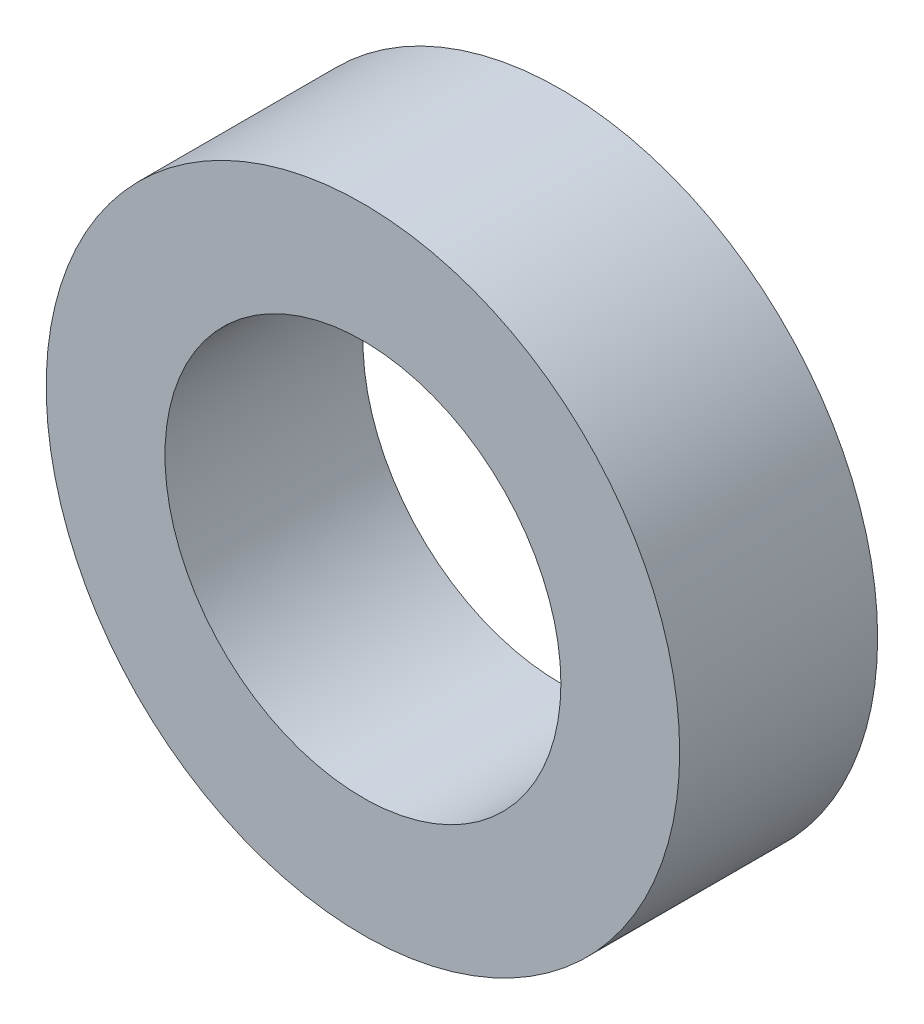
ISO-10303-21;
HEADER;
FILE_DESCRIPTION(('STEP AP214'),'2;1');
FILE_NAME('part.step','',(''),(''),'','','');
FILE_SCHEMA(('AUTOMOTIVE_DESIGN { 1 0 10303 214 1 1 1 1 }'));
ENDSEC;
DATA;
#1=APPLICATION_CONTEXT('core data for automotive mechanical design processes');
#2=APPLICATION_PROTOCOL_DEFINITION('international standard','automotive_design',2000,#1);
#3=PRODUCT_CONTEXT('',#1,'mechanical');
#4=PRODUCT('Part','Part','',(#3));
#5=PRODUCT_RELATED_PRODUCT_CATEGORY('part','',(#4));
#6=PRODUCT_DEFINITION_FORMATION('','',#4);
#7=PRODUCT_DEFINITION_CONTEXT('part definition',#1,'design');
#8=PRODUCT_DEFINITION('design','',#6,#7);
#9=PRODUCT_DEFINITION_SHAPE('','',#8);
#10=(LENGTH_UNIT() NAMED_UNIT(*) SI_UNIT(.MILLI.,.METRE.));
#11=(NAMED_UNIT(*) PLANE_ANGLE_UNIT() SI_UNIT($,.RADIAN.));
#12=(NAMED_UNIT(*) SI_UNIT($,.STERADIAN.) SOLID_ANGLE_UNIT());
#13=UNCERTAINTY_MEASURE_WITH_UNIT(LENGTH_MEASURE(1.E-05),#10,'distance_accuracy_value','');
#14=(GEOMETRIC_REPRESENTATION_CONTEXT(3) GLOBAL_UNCERTAINTY_ASSIGNED_CONTEXT((#13)) GLOBAL_UNIT_ASSIGNED_CONTEXT((#10,
#11,#12)) REPRESENTATION_CONTEXT('',''));
#15=CARTESIAN_POINT('',(0.,0.,0.));
#16=DIRECTION('',(0.,0.,1.));
#17=DIRECTION('',(1.,0.,0.));
#18=AXIS2_PLACEMENT_3D('',#15,#16,#17);
#19=CARTESIAN_POINT('',(0.,0.,2.5));
#20=DIRECTION('',(0.,0.,1.));
#21=DIRECTION('',(1.,0.,0.));
#22=AXIS2_PLACEMENT_3D('',#19,#20,#21);
#23=PLANE('',#22);
#24=CARTESIAN_POINT('',(0.,0.,2.5));
#25=DIRECTION('',(0.,0.,1.));
#26=DIRECTION('',(1.,0.,0.));
#27=AXIS2_PLACEMENT_3D('',#24,#25,#26);
#28=CIRCLE('',#27,4.);
#29=CARTESIAN_POINT('',(4.,0.,2.5));
#30=VERTEX_POINT('',#29);
#31=EDGE_CURVE('E10',#30,#30,#28,.T.);
#32=ORIENTED_EDGE('',*,*,#31,.T.);
#33=EDGE_LOOP('',(#32));
#34=FACE_BOUND('',#33,.T.);
#35=CARTESIAN_POINT('',(0.,0.,2.5));
#36=DIRECTION('',(0.,0.,1.));
#37=DIRECTION('',(1.,0.,0.));
#38=AXIS2_PLACEMENT_3D('',#35,#36,#37);
#39=CIRCLE('',#38,2.5);
#40=CARTESIAN_POINT('',(2.5,0.,2.5));
#41=VERTEX_POINT('',#40);
#42=EDGE_CURVE('E52',#41,#41,#39,.T.);
#43=ORIENTED_EDGE('',*,*,#42,.F.);
#44=EDGE_LOOP('',(#43));
#45=FACE_BOUND('',#44,.T.);
#46=ADVANCED_FACE('F41',(#34,#45),#23,.T.);
#47=CARTESIAN_POINT('',(0.,0.,0.));
#48=DIRECTION('',(0.,0.,1.));
#49=DIRECTION('',(1.,0.,0.));
#50=AXIS2_PLACEMENT_3D('',#47,#48,#49);
#51=PLANE('',#50);
#52=CARTESIAN_POINT('',(0.,0.,0.));
#53=DIRECTION('',(0.,0.,1.));
#54=DIRECTION('',(1.,0.,0.));
#55=AXIS2_PLACEMENT_3D('',#52,#53,#54);
#56=CIRCLE('',#55,4.);
#57=CARTESIAN_POINT('',(4.,0.,0.));
#58=VERTEX_POINT('',#57);
#59=EDGE_CURVE('E45',#58,#58,#56,.T.);
#60=ORIENTED_EDGE('',*,*,#59,.F.);
#61=EDGE_LOOP('',(#60));
#62=FACE_BOUND('',#61,.T.);
#63=CARTESIAN_POINT('',(0.,0.,0.));
#64=DIRECTION('',(0.,0.,1.));
#65=DIRECTION('',(1.,0.,0.));
#66=AXIS2_PLACEMENT_3D('',#63,#64,#65);
#67=CIRCLE('',#66,2.5);
#68=CARTESIAN_POINT('',(2.5,0.,0.));
#69=VERTEX_POINT('',#68);
#70=EDGE_CURVE('E54',#69,#69,#67,.T.);
#71=ORIENTED_EDGE('',*,*,#70,.T.);
#72=EDGE_LOOP('',(#71));
#73=FACE_BOUND('',#72,.T.);
#74=ADVANCED_FACE('F64',(#62,#73),#51,.F.);
#75=CARTESIAN_POINT('',(0.,0.,2.5));
#76=DIRECTION('',(0.,0.,-1.));
#77=DIRECTION('',(-1.,0.,0.));
#78=AXIS2_PLACEMENT_3D('',#75,#76,#77);
#79=CYLINDRICAL_SURFACE('',#78,4.);
#80=ORIENTED_EDGE('',*,*,#31,.F.);
#81=EDGE_LOOP('',(#80));
#82=FACE_BOUND('',#81,.T.);
#83=ORIENTED_EDGE('',*,*,#59,.T.);
#84=EDGE_LOOP('',(#83));
#85=FACE_BOUND('',#84,.T.);
#86=ADVANCED_FACE('F43',(#82,#85),#79,.T.);
#87=CARTESIAN_POINT('',(0.,0.,2.5));
#88=DIRECTION('',(0.,0.,-1.));
#89=DIRECTION('',(-1.,0.,0.));
#90=AXIS2_PLACEMENT_3D('',#87,#88,#89);
#91=CYLINDRICAL_SURFACE('',#90,2.5);
#92=ORIENTED_EDGE('',*,*,#42,.T.);
#93=EDGE_LOOP('',(#92));
#94=FACE_BOUND('',#93,.T.);
#95=ORIENTED_EDGE('',*,*,#70,.F.);
#96=EDGE_LOOP('',(#95));
#97=FACE_BOUND('',#96,.T.);
#98=ADVANCED_FACE('F60',(#94,#97),#91,.F.);
#99=CLOSED_SHELL('',(#46,#74,#86,#98));
#100=MANIFOLD_SOLID_BREP('B2',#99);
#101=ADVANCED_BREP_SHAPE_REPRESENTATION('',(#18,#100),#14);
#102=SHAPE_DEFINITION_REPRESENTATION(#9,#101);
ENDSEC;
END-ISO-10303-21;
